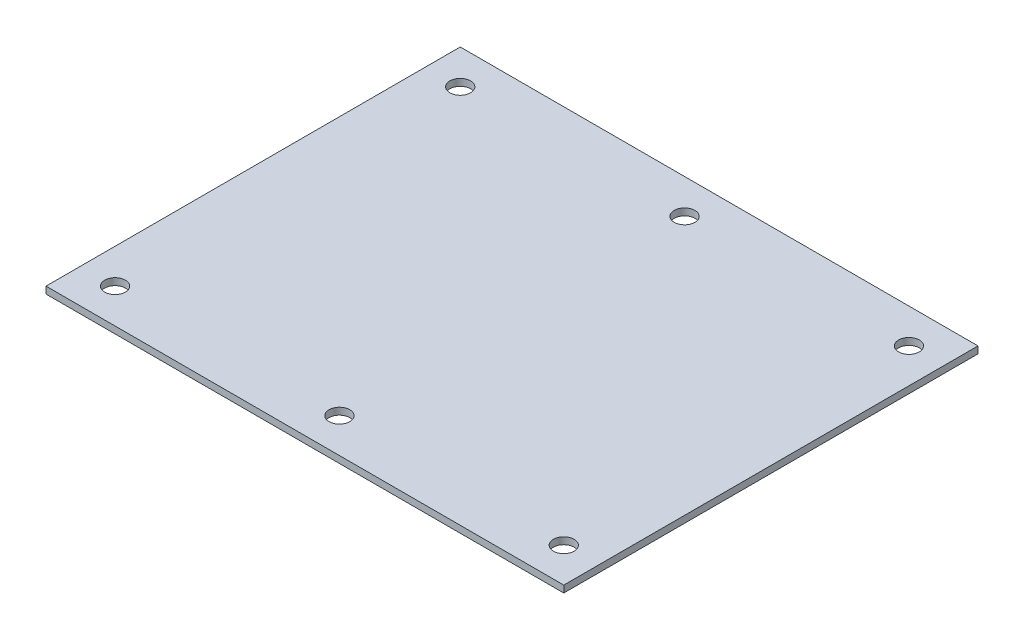
ISO-10303-21;
HEADER;
FILE_DESCRIPTION(('STEP AP214'),'2;1');
FILE_NAME('part.step','',(''),(''),'','','');
FILE_SCHEMA(('AUTOMOTIVE_DESIGN { 1 0 10303 214 1 1 1 1 }'));
ENDSEC;
DATA;
#1=APPLICATION_CONTEXT('core data for automotive mechanical design processes');
#2=APPLICATION_PROTOCOL_DEFINITION('international standard','automotive_design',2000,#1);
#3=PRODUCT_CONTEXT('',#1,'mechanical');
#4=PRODUCT('Part','Part','',(#3));
#5=PRODUCT_RELATED_PRODUCT_CATEGORY('part','',(#4));
#6=PRODUCT_DEFINITION_FORMATION('','',#4);
#7=PRODUCT_DEFINITION_CONTEXT('part definition',#1,'design');
#8=PRODUCT_DEFINITION('design','',#6,#7);
#9=PRODUCT_DEFINITION_SHAPE('','',#8);
#10=(LENGTH_UNIT() NAMED_UNIT(*) SI_UNIT(.MILLI.,.METRE.));
#11=(NAMED_UNIT(*) PLANE_ANGLE_UNIT() SI_UNIT($,.RADIAN.));
#12=(NAMED_UNIT(*) SI_UNIT($,.STERADIAN.) SOLID_ANGLE_UNIT());
#13=UNCERTAINTY_MEASURE_WITH_UNIT(LENGTH_MEASURE(1.E-05),#10,'distance_accuracy_value','');
#14=(GEOMETRIC_REPRESENTATION_CONTEXT(3) GLOBAL_UNCERTAINTY_ASSIGNED_CONTEXT((#13)) GLOBAL_UNIT_ASSIGNED_CONTEXT((#10,
#11,#12)) REPRESENTATION_CONTEXT('',''));
#15=CARTESIAN_POINT('',(0.,0.,0.));
#16=DIRECTION('',(0.,0.,1.));
#17=DIRECTION('',(1.,0.,0.));
#18=AXIS2_PLACEMENT_3D('',#15,#16,#17);
#19=CARTESIAN_POINT('',(37.5,1.,-30.));
#20=DIRECTION('',(-1.,0.,0.));
#21=DIRECTION('',(0.,0.,1.));
#22=AXIS2_PLACEMENT_3D('',#19,#20,#21);
#23=PLANE('',#22);
#24=DIRECTION('',(0.,0.,-1.));
#25=VECTOR('',#24,1.);
#26=CARTESIAN_POINT('',(37.5,0.,-30.));
#27=LINE('',#26,#25);
#28=CARTESIAN_POINT('',(37.5,0.,30.));
#29=VERTEX_POINT('',#28);
#30=CARTESIAN_POINT('',(37.5,0.,-30.));
#31=VERTEX_POINT('',#30);
#32=EDGE_CURVE('E97',#29,#31,#27,.T.);
#33=ORIENTED_EDGE('',*,*,#32,.T.);
#34=DIRECTION('',(0.,-1.,0.));
#35=VECTOR('',#34,1.);
#36=CARTESIAN_POINT('',(37.5,1.,-30.));
#37=LINE('',#36,#35);
#38=CARTESIAN_POINT('',(37.5,1.,-30.));
#39=VERTEX_POINT('',#38);
#40=EDGE_CURVE('E11',#39,#31,#37,.T.);
#41=ORIENTED_EDGE('',*,*,#40,.F.);
#42=DIRECTION('',(0.,0.,-1.));
#43=VECTOR('',#42,1.);
#44=CARTESIAN_POINT('',(37.5,1.,-30.));
#45=LINE('',#44,#43);
#46=CARTESIAN_POINT('',(37.5,1.,30.));
#47=VERTEX_POINT('',#46);
#48=EDGE_CURVE('E85',#47,#39,#45,.T.);
#49=ORIENTED_EDGE('',*,*,#48,.F.);
#50=DIRECTION('',(0.,-1.,0.));
#51=VECTOR('',#50,1.);
#52=CARTESIAN_POINT('',(37.5,1.,30.));
#53=LINE('',#52,#51);
#54=EDGE_CURVE('E93',#47,#29,#53,.T.);
#55=ORIENTED_EDGE('',*,*,#54,.T.);
#56=EDGE_LOOP('',(#33,#41,#49,#55));
#57=FACE_BOUND('',#56,.T.);
#58=ADVANCED_FACE('F34',(#57),#23,.F.);
#59=CARTESIAN_POINT('',(-37.5,1.,-30.));
#60=DIRECTION('',(0.,0.,1.));
#61=DIRECTION('',(1.,0.,0.));
#62=AXIS2_PLACEMENT_3D('',#59,#60,#61);
#63=PLANE('',#62);
#64=DIRECTION('',(-1.,0.,0.));
#65=VECTOR('',#64,1.);
#66=CARTESIAN_POINT('',(-37.5,0.,-30.));
#67=LINE('',#66,#65);
#68=CARTESIAN_POINT('',(-37.5,0.,-30.));
#69=VERTEX_POINT('',#68);
#70=EDGE_CURVE('E89',#31,#69,#67,.T.);
#71=ORIENTED_EDGE('',*,*,#70,.T.);
#72=DIRECTION('',(0.,-1.,0.));
#73=VECTOR('',#72,1.);
#74=CARTESIAN_POINT('',(-37.5,1.,-30.));
#75=LINE('',#74,#73);
#76=CARTESIAN_POINT('',(-37.5,1.,-30.));
#77=VERTEX_POINT('',#76);
#78=EDGE_CURVE('E42',#77,#69,#75,.T.);
#79=ORIENTED_EDGE('',*,*,#78,.F.);
#80=DIRECTION('',(-1.,0.,0.));
#81=VECTOR('',#80,1.);
#82=CARTESIAN_POINT('',(-37.5,1.,-30.));
#83=LINE('',#82,#81);
#84=EDGE_CURVE('E80',#39,#77,#83,.T.);
#85=ORIENTED_EDGE('',*,*,#84,.F.);
#86=ORIENTED_EDGE('',*,*,#40,.T.);
#87=EDGE_LOOP('',(#71,#79,#85,#86));
#88=FACE_BOUND('',#87,.T.);
#89=ADVANCED_FACE('F88',(#88),#63,.F.);
#90=CARTESIAN_POINT('',(-37.5,1.,-30.));
#91=DIRECTION('',(1.,0.,0.));
#92=DIRECTION('',(0.,0.,-1.));
#93=AXIS2_PLACEMENT_3D('',#90,#91,#92);
#94=PLANE('',#93);
#95=DIRECTION('',(0.,0.,1.));
#96=VECTOR('',#95,1.);
#97=CARTESIAN_POINT('',(-37.5,0.,-30.));
#98=LINE('',#97,#96);
#99=CARTESIAN_POINT('',(-37.5,0.,30.));
#100=VERTEX_POINT('',#99);
#101=EDGE_CURVE('E67',#69,#100,#98,.T.);
#102=ORIENTED_EDGE('',*,*,#101,.T.);
#103=DIRECTION('',(0.,-1.,0.));
#104=VECTOR('',#103,1.);
#105=CARTESIAN_POINT('',(-37.5,1.,30.));
#106=LINE('',#105,#104);
#107=CARTESIAN_POINT('',(-37.5,1.,30.));
#108=VERTEX_POINT('',#107);
#109=EDGE_CURVE('E90',#108,#100,#106,.T.);
#110=ORIENTED_EDGE('',*,*,#109,.F.);
#111=DIRECTION('',(0.,0.,1.));
#112=VECTOR('',#111,1.);
#113=CARTESIAN_POINT('',(-37.5,1.,-30.));
#114=LINE('',#113,#112);
#115=EDGE_CURVE('E83',#77,#108,#114,.T.);
#116=ORIENTED_EDGE('',*,*,#115,.F.);
#117=ORIENTED_EDGE('',*,*,#78,.T.);
#118=EDGE_LOOP('',(#102,#110,#116,#117));
#119=FACE_BOUND('',#118,.T.);
#120=ADVANCED_FACE('F91',(#119),#94,.F.);
#121=CARTESIAN_POINT('',(-37.5,1.,30.));
#122=DIRECTION('',(0.,0.,-1.));
#123=DIRECTION('',(-1.,0.,0.));
#124=AXIS2_PLACEMENT_3D('',#121,#122,#123);
#125=PLANE('',#124);
#126=DIRECTION('',(1.,0.,0.));
#127=VECTOR('',#126,1.);
#128=CARTESIAN_POINT('',(-37.5,0.,30.));
#129=LINE('',#128,#127);
#130=EDGE_CURVE('E73',#100,#29,#129,.T.);
#131=ORIENTED_EDGE('',*,*,#130,.T.);
#132=ORIENTED_EDGE('',*,*,#54,.F.);
#133=DIRECTION('',(1.,0.,0.));
#134=VECTOR('',#133,1.);
#135=CARTESIAN_POINT('',(-37.5,1.,30.));
#136=LINE('',#135,#134);
#137=EDGE_CURVE('E50',#108,#47,#136,.T.);
#138=ORIENTED_EDGE('',*,*,#137,.F.);
#139=ORIENTED_EDGE('',*,*,#109,.T.);
#140=EDGE_LOOP('',(#131,#132,#138,#139));
#141=FACE_BOUND('',#140,.T.);
#142=ADVANCED_FACE('F105',(#141),#125,.F.);
#143=CARTESIAN_POINT('',(0.,1.,0.));
#144=DIRECTION('',(0.,1.,0.));
#145=DIRECTION('',(0.,0.,1.));
#146=AXIS2_PLACEMENT_3D('',#143,#144,#145);
#147=PLANE('',#146);
#148=CARTESIAN_POINT('',(1.74773390204663E-13,1.,24.9999999999999));
#149=DIRECTION('',(0.,1.,0.));
#150=DIRECTION('',(0.,0.,-1.));
#151=AXIS2_PLACEMENT_3D('',#148,#149,#150);
#152=CIRCLE('',#151,1.5);
#153=CARTESIAN_POINT('',(1.74773390204663E-13,1.,23.4999999999999));
#154=VERTEX_POINT('',#153);
#155=EDGE_CURVE('E132',#154,#154,#152,.T.);
#156=ORIENTED_EDGE('',*,*,#155,.F.);
#157=EDGE_LOOP('',(#156));
#158=FACE_BOUND('',#157,.T.);
#159=CARTESIAN_POINT('',(32.5,1.,-25.));
#160=DIRECTION('',(0.,1.,0.));
#161=DIRECTION('',(0.,0.,-1.));
#162=AXIS2_PLACEMENT_3D('',#159,#160,#161);
#163=CIRCLE('',#162,1.5);
#164=CARTESIAN_POINT('',(32.5,1.,-26.5));
#165=VERTEX_POINT('',#164);
#166=EDGE_CURVE('E121',#165,#165,#163,.T.);
#167=ORIENTED_EDGE('',*,*,#166,.F.);
#168=EDGE_LOOP('',(#167));
#169=FACE_BOUND('',#168,.T.);
#170=CARTESIAN_POINT('',(32.5,1.,25.));
#171=DIRECTION('',(0.,1.,0.));
#172=DIRECTION('',(0.,0.,1.));
#173=AXIS2_PLACEMENT_3D('',#170,#171,#172);
#174=CIRCLE('',#173,1.5);
#175=CARTESIAN_POINT('',(32.5,1.,26.5));
#176=VERTEX_POINT('',#175);
#177=EDGE_CURVE('E120',#176,#176,#174,.T.);
#178=ORIENTED_EDGE('',*,*,#177,.F.);
#179=EDGE_LOOP('',(#178));
#180=FACE_BOUND('',#179,.T.);
#181=CARTESIAN_POINT('',(-32.5,1.,25.));
#182=DIRECTION('',(0.,1.,0.));
#183=DIRECTION('',(0.,0.,-1.));
#184=AXIS2_PLACEMENT_3D('',#181,#182,#183);
#185=CIRCLE('',#184,1.5);
#186=CARTESIAN_POINT('',(-32.5,1.,23.5));
#187=VERTEX_POINT('',#186);
#188=EDGE_CURVE('E114',#187,#187,#185,.T.);
#189=ORIENTED_EDGE('',*,*,#188,.F.);
#190=EDGE_LOOP('',(#189));
#191=FACE_BOUND('',#190,.T.);
#192=CARTESIAN_POINT('',(0.,1.,-25.));
#193=DIRECTION('',(0.,1.,0.));
#194=DIRECTION('',(0.,0.,-1.));
#195=AXIS2_PLACEMENT_3D('',#192,#193,#194);
#196=CIRCLE('',#195,1.5);
#197=CARTESIAN_POINT('',(0.,1.,-26.5));
#198=VERTEX_POINT('',#197);
#199=EDGE_CURVE('E133',#198,#198,#196,.T.);
#200=ORIENTED_EDGE('',*,*,#199,.F.);
#201=EDGE_LOOP('',(#200));
#202=FACE_BOUND('',#201,.T.);
#203=CARTESIAN_POINT('',(-32.5,1.,-25.));
#204=DIRECTION('',(0.,1.,0.));
#205=DIRECTION('',(0.,0.,1.));
#206=AXIS2_PLACEMENT_3D('',#203,#204,#205);
#207=CIRCLE('',#206,1.5);
#208=CARTESIAN_POINT('',(-32.5,1.,-23.5));
#209=VERTEX_POINT('',#208);
#210=EDGE_CURVE('E100',#209,#209,#207,.T.);
#211=ORIENTED_EDGE('',*,*,#210,.F.);
#212=EDGE_LOOP('',(#211));
#213=FACE_BOUND('',#212,.T.);
#214=ORIENTED_EDGE('',*,*,#48,.T.);
#215=ORIENTED_EDGE('',*,*,#84,.T.);
#216=ORIENTED_EDGE('',*,*,#115,.T.);
#217=ORIENTED_EDGE('',*,*,#137,.T.);
#218=EDGE_LOOP('',(#214,#215,#216,#217));
#219=FACE_BOUND('',#218,.T.);
#220=ADVANCED_FACE('F81',(#158,#169,#180,#191,#202,#213,#219),#147,.T.);
#221=CARTESIAN_POINT('',(0.,0.,0.));
#222=DIRECTION('',(0.,1.,0.));
#223=DIRECTION('',(0.,0.,1.));
#224=AXIS2_PLACEMENT_3D('',#221,#222,#223);
#225=PLANE('',#224);
#226=CARTESIAN_POINT('',(1.74773390204663E-13,0.,24.9999999999999));
#227=DIRECTION('',(0.,1.,0.));
#228=DIRECTION('',(0.,0.,-1.));
#229=AXIS2_PLACEMENT_3D('',#226,#227,#228);
#230=CIRCLE('',#229,1.5);
#231=CARTESIAN_POINT('',(1.74773390204663E-13,0.,23.4999999999999));
#232=VERTEX_POINT('',#231);
#233=EDGE_CURVE('E129',#232,#232,#230,.T.);
#234=ORIENTED_EDGE('',*,*,#233,.T.);
#235=EDGE_LOOP('',(#234));
#236=FACE_BOUND('',#235,.T.);
#237=CARTESIAN_POINT('',(32.5,0.,-25.));
#238=DIRECTION('',(0.,1.,0.));
#239=DIRECTION('',(0.,0.,-1.));
#240=AXIS2_PLACEMENT_3D('',#237,#238,#239);
#241=CIRCLE('',#240,1.5);
#242=CARTESIAN_POINT('',(32.5,0.,-26.5));
#243=VERTEX_POINT('',#242);
#244=EDGE_CURVE('E136',#243,#243,#241,.T.);
#245=ORIENTED_EDGE('',*,*,#244,.T.);
#246=EDGE_LOOP('',(#245));
#247=FACE_BOUND('',#246,.T.);
#248=CARTESIAN_POINT('',(32.5,0.,25.));
#249=DIRECTION('',(0.,1.,0.));
#250=DIRECTION('',(0.,0.,1.));
#251=AXIS2_PLACEMENT_3D('',#248,#249,#250);
#252=CIRCLE('',#251,1.5);
#253=CARTESIAN_POINT('',(32.5,0.,26.5));
#254=VERTEX_POINT('',#253);
#255=EDGE_CURVE('E117',#254,#254,#252,.T.);
#256=ORIENTED_EDGE('',*,*,#255,.T.);
#257=EDGE_LOOP('',(#256));
#258=FACE_BOUND('',#257,.T.);
#259=CARTESIAN_POINT('',(-32.5,0.,25.));
#260=DIRECTION('',(0.,1.,0.));
#261=DIRECTION('',(0.,0.,-1.));
#262=AXIS2_PLACEMENT_3D('',#259,#260,#261);
#263=CIRCLE('',#262,1.5);
#264=CARTESIAN_POINT('',(-32.5,0.,23.5));
#265=VERTEX_POINT('',#264);
#266=EDGE_CURVE('E124',#265,#265,#263,.T.);
#267=ORIENTED_EDGE('',*,*,#266,.T.);
#268=EDGE_LOOP('',(#267));
#269=FACE_BOUND('',#268,.T.);
#270=CARTESIAN_POINT('',(0.,0.,-25.));
#271=DIRECTION('',(0.,1.,0.));
#272=DIRECTION('',(0.,0.,-1.));
#273=AXIS2_PLACEMENT_3D('',#270,#271,#272);
#274=CIRCLE('',#273,1.5);
#275=CARTESIAN_POINT('',(0.,0.,-26.5));
#276=VERTEX_POINT('',#275);
#277=EDGE_CURVE('E141',#276,#276,#274,.T.);
#278=ORIENTED_EDGE('',*,*,#277,.T.);
#279=EDGE_LOOP('',(#278));
#280=FACE_BOUND('',#279,.T.);
#281=CARTESIAN_POINT('',(-32.5,0.,-25.));
#282=DIRECTION('',(0.,1.,0.));
#283=DIRECTION('',(0.,0.,1.));
#284=AXIS2_PLACEMENT_3D('',#281,#282,#283);
#285=CIRCLE('',#284,1.5);
#286=CARTESIAN_POINT('',(-32.5,0.,-23.5));
#287=VERTEX_POINT('',#286);
#288=EDGE_CURVE('E111',#287,#287,#285,.T.);
#289=ORIENTED_EDGE('',*,*,#288,.T.);
#290=EDGE_LOOP('',(#289));
#291=FACE_BOUND('',#290,.T.);
#292=ORIENTED_EDGE('',*,*,#32,.F.);
#293=ORIENTED_EDGE('',*,*,#130,.F.);
#294=ORIENTED_EDGE('',*,*,#101,.F.);
#295=ORIENTED_EDGE('',*,*,#70,.F.);
#296=EDGE_LOOP('',(#292,#293,#294,#295));
#297=FACE_BOUND('',#296,.T.);
#298=ADVANCED_FACE('F108',(#236,#247,#258,#269,#280,#291,#297),#225,.F.);
#299=CARTESIAN_POINT('',(-32.5,1.,-25.));
#300=DIRECTION('',(0.,-1.,0.));
#301=DIRECTION('',(0.,0.,-1.));
#302=AXIS2_PLACEMENT_3D('',#299,#300,#301);
#303=CYLINDRICAL_SURFACE('',#302,1.5);
#304=ORIENTED_EDGE('',*,*,#210,.T.);
#305=EDGE_LOOP('',(#304));
#306=FACE_BOUND('',#305,.T.);
#307=ORIENTED_EDGE('',*,*,#288,.F.);
#308=EDGE_LOOP('',(#307));
#309=FACE_BOUND('',#308,.T.);
#310=ADVANCED_FACE('F156',(#306,#309),#303,.F.);
#311=CARTESIAN_POINT('',(0.,1.,-25.));
#312=DIRECTION('',(0.,-1.,0.));
#313=DIRECTION('',(0.,0.,-1.));
#314=AXIS2_PLACEMENT_3D('',#311,#312,#313);
#315=CYLINDRICAL_SURFACE('',#314,1.5);
#316=ORIENTED_EDGE('',*,*,#199,.T.);
#317=EDGE_LOOP('',(#316));
#318=FACE_BOUND('',#317,.T.);
#319=ORIENTED_EDGE('',*,*,#277,.F.);
#320=EDGE_LOOP('',(#319));
#321=FACE_BOUND('',#320,.T.);
#322=ADVANCED_FACE('F147',(#318,#321),#315,.F.);
#323=CARTESIAN_POINT('',(-32.5,1.,25.));
#324=DIRECTION('',(0.,-1.,0.));
#325=DIRECTION('',(0.,0.,-1.));
#326=AXIS2_PLACEMENT_3D('',#323,#324,#325);
#327=CYLINDRICAL_SURFACE('',#326,1.5);
#328=ORIENTED_EDGE('',*,*,#188,.T.);
#329=EDGE_LOOP('',(#328));
#330=FACE_BOUND('',#329,.T.);
#331=ORIENTED_EDGE('',*,*,#266,.F.);
#332=EDGE_LOOP('',(#331));
#333=FACE_BOUND('',#332,.T.);
#334=ADVANCED_FACE('F205',(#330,#333),#327,.F.);
#335=CARTESIAN_POINT('',(32.5,1.,25.));
#336=DIRECTION('',(0.,-1.,0.));
#337=DIRECTION('',(0.,0.,-1.));
#338=AXIS2_PLACEMENT_3D('',#335,#336,#337);
#339=CYLINDRICAL_SURFACE('',#338,1.5);
#340=ORIENTED_EDGE('',*,*,#177,.T.);
#341=EDGE_LOOP('',(#340));
#342=FACE_BOUND('',#341,.T.);
#343=ORIENTED_EDGE('',*,*,#255,.F.);
#344=EDGE_LOOP('',(#343));
#345=FACE_BOUND('',#344,.T.);
#346=ADVANCED_FACE('F214',(#342,#345),#339,.F.);
#347=CARTESIAN_POINT('',(32.5,1.,-25.));
#348=DIRECTION('',(0.,-1.,0.));
#349=DIRECTION('',(0.,0.,-1.));
#350=AXIS2_PLACEMENT_3D('',#347,#348,#349);
#351=CYLINDRICAL_SURFACE('',#350,1.5);
#352=ORIENTED_EDGE('',*,*,#166,.T.);
#353=EDGE_LOOP('',(#352));
#354=FACE_BOUND('',#353,.T.);
#355=ORIENTED_EDGE('',*,*,#244,.F.);
#356=EDGE_LOOP('',(#355));
#357=FACE_BOUND('',#356,.T.);
#358=ADVANCED_FACE('F224',(#354,#357),#351,.F.);
#359=CARTESIAN_POINT('',(1.74773390204663E-13,1.,24.9999999999999));
#360=DIRECTION('',(0.,-1.,0.));
#361=DIRECTION('',(0.,0.,-1.));
#362=AXIS2_PLACEMENT_3D('',#359,#360,#361);
#363=CYLINDRICAL_SURFACE('',#362,1.5);
#364=ORIENTED_EDGE('',*,*,#155,.T.);
#365=EDGE_LOOP('',(#364));
#366=FACE_BOUND('',#365,.T.);
#367=ORIENTED_EDGE('',*,*,#233,.F.);
#368=EDGE_LOOP('',(#367));
#369=FACE_BOUND('',#368,.T.);
#370=ADVANCED_FACE('F234',(#366,#369),#363,.F.);
#371=CLOSED_SHELL('',(#58,#89,#120,#142,#220,#298,#310,#322,#334,#346,#358,#370));
#372=MANIFOLD_SOLID_BREP('B2',#371);
#373=ADVANCED_BREP_SHAPE_REPRESENTATION('',(#18,#372),#14);
#374=SHAPE_DEFINITION_REPRESENTATION(#9,#373);
ENDSEC;
END-ISO-10303-21;
